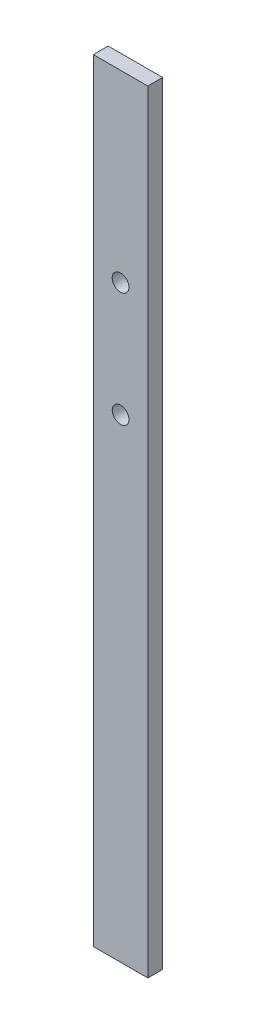
ISO-10303-21;
HEADER;
FILE_DESCRIPTION(('STEP AP214'),'2;1');
FILE_NAME('part.step','',(''),(''),'','','');
FILE_SCHEMA(('AUTOMOTIVE_DESIGN { 1 0 10303 214 1 1 1 1 }'));
ENDSEC;
DATA;
#1=APPLICATION_CONTEXT('core data for automotive mechanical design processes');
#2=APPLICATION_PROTOCOL_DEFINITION('international standard','automotive_design',2000,#1);
#3=PRODUCT_CONTEXT('',#1,'mechanical');
#4=PRODUCT('Part','Part','',(#3));
#5=PRODUCT_RELATED_PRODUCT_CATEGORY('part','',(#4));
#6=PRODUCT_DEFINITION_FORMATION('','',#4);
#7=PRODUCT_DEFINITION_CONTEXT('part definition',#1,'design');
#8=PRODUCT_DEFINITION('design','',#6,#7);
#9=PRODUCT_DEFINITION_SHAPE('','',#8);
#10=(LENGTH_UNIT() NAMED_UNIT(*) SI_UNIT(.MILLI.,.METRE.));
#11=(NAMED_UNIT(*) PLANE_ANGLE_UNIT() SI_UNIT($,.RADIAN.));
#12=(NAMED_UNIT(*) SI_UNIT($,.STERADIAN.) SOLID_ANGLE_UNIT());
#13=UNCERTAINTY_MEASURE_WITH_UNIT(LENGTH_MEASURE(1.E-05),#10,'distance_accuracy_value','');
#14=(GEOMETRIC_REPRESENTATION_CONTEXT(3) GLOBAL_UNCERTAINTY_ASSIGNED_CONTEXT((#13)) GLOBAL_UNIT_ASSIGNED_CONTEXT((#10,
#11,#12)) REPRESENTATION_CONTEXT('',''));
#15=CARTESIAN_POINT('',(0.,0.,0.));
#16=DIRECTION('',(0.,0.,1.));
#17=DIRECTION('',(1.,0.,0.));
#18=AXIS2_PLACEMENT_3D('',#15,#16,#17);
#19=CARTESIAN_POINT('',(69.85,1981.2,19.05));
#20=DIRECTION('',(-1.,0.,0.));
#21=DIRECTION('',(0.,0.,1.));
#22=AXIS2_PLACEMENT_3D('',#19,#20,#21);
#23=PLANE('',#22);
#24=DIRECTION('',(0.,0.,-1.));
#25=VECTOR('',#24,1.);
#26=CARTESIAN_POINT('',(69.85,0.,19.05));
#27=LINE('',#26,#25);
#28=CARTESIAN_POINT('',(69.85,0.,19.05));
#29=VERTEX_POINT('',#28);
#30=CARTESIAN_POINT('',(69.85,0.,-19.05));
#31=VERTEX_POINT('',#30);
#32=EDGE_CURVE('E96',#29,#31,#27,.T.);
#33=ORIENTED_EDGE('',*,*,#32,.T.);
#34=DIRECTION('',(0.,-1.,0.));
#35=VECTOR('',#34,1.);
#36=CARTESIAN_POINT('',(69.85,1981.2,-19.05));
#37=LINE('',#36,#35);
#38=CARTESIAN_POINT('',(69.85,1981.2,-19.05));
#39=VERTEX_POINT('',#38);
#40=EDGE_CURVE('E11',#39,#31,#37,.T.);
#41=ORIENTED_EDGE('',*,*,#40,.F.);
#42=DIRECTION('',(0.,0.,-1.));
#43=VECTOR('',#42,1.);
#44=CARTESIAN_POINT('',(69.85,1981.2,19.05));
#45=LINE('',#44,#43);
#46=CARTESIAN_POINT('',(69.85,1981.2,19.05));
#47=VERTEX_POINT('',#46);
#48=EDGE_CURVE('E84',#47,#39,#45,.T.);
#49=ORIENTED_EDGE('',*,*,#48,.F.);
#50=DIRECTION('',(0.,-1.,0.));
#51=VECTOR('',#50,1.);
#52=CARTESIAN_POINT('',(69.85,1981.2,19.05));
#53=LINE('',#52,#51);
#54=EDGE_CURVE('E92',#47,#29,#53,.T.);
#55=ORIENTED_EDGE('',*,*,#54,.T.);
#56=EDGE_LOOP('',(#33,#41,#49,#55));
#57=FACE_BOUND('',#56,.T.);
#58=ADVANCED_FACE('F33',(#57),#23,.F.);
#59=CARTESIAN_POINT('',(-69.85,1981.2,-19.05));
#60=DIRECTION('',(0.,0.,1.));
#61=DIRECTION('',(1.,0.,0.));
#62=AXIS2_PLACEMENT_3D('',#59,#60,#61);
#63=PLANE('',#62);
#64=CARTESIAN_POINT('',(0.,1216.025,-19.05));
#65=DIRECTION('',(0.,0.,-1.));
#66=DIRECTION('',(-1.,0.,0.));
#67=AXIS2_PLACEMENT_3D('',#64,#65,#66);
#68=CIRCLE('',#67,21.43125);
#69=CARTESIAN_POINT('',(-21.43125,1216.025,-19.05));
#70=VERTEX_POINT('',#69);
#71=EDGE_CURVE('E118',#70,#70,#68,.T.);
#72=ORIENTED_EDGE('',*,*,#71,.F.);
#73=EDGE_LOOP('',(#72));
#74=FACE_BOUND('',#73,.T.);
#75=CARTESIAN_POINT('',(0.,1509.7125,-19.05));
#76=DIRECTION('',(0.,0.,-1.));
#77=DIRECTION('',(-1.,0.,0.));
#78=AXIS2_PLACEMENT_3D('',#75,#76,#77);
#79=CIRCLE('',#78,21.43125);
#80=CARTESIAN_POINT('',(-21.43125,1509.7125,-19.05));
#81=VERTEX_POINT('',#80);
#82=EDGE_CURVE('E112',#81,#81,#79,.T.);
#83=ORIENTED_EDGE('',*,*,#82,.F.);
#84=EDGE_LOOP('',(#83));
#85=FACE_BOUND('',#84,.T.);
#86=DIRECTION('',(-1.,0.,0.));
#87=VECTOR('',#86,1.);
#88=CARTESIAN_POINT('',(-69.85,0.,-19.05));
#89=LINE('',#88,#87);
#90=CARTESIAN_POINT('',(-69.85,0.,-19.05));
#91=VERTEX_POINT('',#90);
#92=EDGE_CURVE('E88',#31,#91,#89,.T.);
#93=ORIENTED_EDGE('',*,*,#92,.T.);
#94=DIRECTION('',(0.,-1.,0.));
#95=VECTOR('',#94,1.);
#96=CARTESIAN_POINT('',(-69.85,1981.2,-19.05));
#97=LINE('',#96,#95);
#98=CARTESIAN_POINT('',(-69.85,1981.2,-19.05));
#99=VERTEX_POINT('',#98);
#100=EDGE_CURVE('E41',#99,#91,#97,.T.);
#101=ORIENTED_EDGE('',*,*,#100,.F.);
#102=DIRECTION('',(-1.,0.,0.));
#103=VECTOR('',#102,1.);
#104=CARTESIAN_POINT('',(-69.85,1981.2,-19.05));
#105=LINE('',#104,#103);
#106=EDGE_CURVE('E79',#39,#99,#105,.T.);
#107=ORIENTED_EDGE('',*,*,#106,.F.);
#108=ORIENTED_EDGE('',*,*,#40,.T.);
#109=EDGE_LOOP('',(#93,#101,#107,#108));
#110=FACE_BOUND('',#109,.T.);
#111=ADVANCED_FACE('F87',(#74,#85,#110),#63,.F.);
#112=CARTESIAN_POINT('',(-69.85,1981.2,19.05));
#113=DIRECTION('',(1.,0.,0.));
#114=DIRECTION('',(0.,0.,-1.));
#115=AXIS2_PLACEMENT_3D('',#112,#113,#114);
#116=PLANE('',#115);
#117=DIRECTION('',(0.,0.,1.));
#118=VECTOR('',#117,1.);
#119=CARTESIAN_POINT('',(-69.85,0.,19.05));
#120=LINE('',#119,#118);
#121=CARTESIAN_POINT('',(-69.85,0.,19.05));
#122=VERTEX_POINT('',#121);
#123=EDGE_CURVE('E66',#91,#122,#120,.T.);
#124=ORIENTED_EDGE('',*,*,#123,.T.);
#125=DIRECTION('',(0.,-1.,0.));
#126=VECTOR('',#125,1.);
#127=CARTESIAN_POINT('',(-69.85,1981.2,19.05));
#128=LINE('',#127,#126);
#129=CARTESIAN_POINT('',(-69.85,1981.2,19.05));
#130=VERTEX_POINT('',#129);
#131=EDGE_CURVE('E89',#130,#122,#128,.T.);
#132=ORIENTED_EDGE('',*,*,#131,.F.);
#133=DIRECTION('',(0.,0.,1.));
#134=VECTOR('',#133,1.);
#135=CARTESIAN_POINT('',(-69.85,1981.2,19.05));
#136=LINE('',#135,#134);
#137=EDGE_CURVE('E82',#99,#130,#136,.T.);
#138=ORIENTED_EDGE('',*,*,#137,.F.);
#139=ORIENTED_EDGE('',*,*,#100,.T.);
#140=EDGE_LOOP('',(#124,#132,#138,#139));
#141=FACE_BOUND('',#140,.T.);
#142=ADVANCED_FACE('F90',(#141),#116,.F.);
#143=CARTESIAN_POINT('',(-69.85,1981.2,19.05));
#144=DIRECTION('',(0.,0.,-1.));
#145=DIRECTION('',(-1.,0.,0.));
#146=AXIS2_PLACEMENT_3D('',#143,#144,#145);
#147=PLANE('',#146);
#148=CARTESIAN_POINT('',(0.,1216.025,19.05));
#149=DIRECTION('',(0.,0.,-1.));
#150=DIRECTION('',(-1.,0.,0.));
#151=AXIS2_PLACEMENT_3D('',#148,#149,#150);
#152=CIRCLE('',#151,21.43125);
#153=CARTESIAN_POINT('',(-21.43125,1216.025,19.05));
#154=VERTEX_POINT('',#153);
#155=EDGE_CURVE('E115',#154,#154,#152,.T.);
#156=ORIENTED_EDGE('',*,*,#155,.T.);
#157=EDGE_LOOP('',(#156));
#158=FACE_BOUND('',#157,.T.);
#159=CARTESIAN_POINT('',(0.,1509.7125,19.05));
#160=DIRECTION('',(0.,0.,-1.));
#161=DIRECTION('',(-1.,0.,0.));
#162=AXIS2_PLACEMENT_3D('',#159,#160,#161);
#163=CIRCLE('',#162,21.43125);
#164=CARTESIAN_POINT('',(-21.43125,1509.7125,19.05));
#165=VERTEX_POINT('',#164);
#166=EDGE_CURVE('E99',#165,#165,#163,.T.);
#167=ORIENTED_EDGE('',*,*,#166,.T.);
#168=EDGE_LOOP('',(#167));
#169=FACE_BOUND('',#168,.T.);
#170=DIRECTION('',(1.,0.,0.));
#171=VECTOR('',#170,1.);
#172=CARTESIAN_POINT('',(-69.85,0.,19.05));
#173=LINE('',#172,#171);
#174=EDGE_CURVE('E72',#122,#29,#173,.T.);
#175=ORIENTED_EDGE('',*,*,#174,.T.);
#176=ORIENTED_EDGE('',*,*,#54,.F.);
#177=DIRECTION('',(1.,0.,0.));
#178=VECTOR('',#177,1.);
#179=CARTESIAN_POINT('',(-69.85,1981.2,19.05));
#180=LINE('',#179,#178);
#181=EDGE_CURVE('E49',#130,#47,#180,.T.);
#182=ORIENTED_EDGE('',*,*,#181,.F.);
#183=ORIENTED_EDGE('',*,*,#131,.T.);
#184=EDGE_LOOP('',(#175,#176,#182,#183));
#185=FACE_BOUND('',#184,.T.);
#186=ADVANCED_FACE('F104',(#158,#169,#185),#147,.F.);
#187=CARTESIAN_POINT('',(0.,1981.2,0.));
#188=DIRECTION('',(0.,-1.,0.));
#189=DIRECTION('',(0.,0.,-1.));
#190=AXIS2_PLACEMENT_3D('',#187,#188,#189);
#191=PLANE('',#190);
#192=ORIENTED_EDGE('',*,*,#48,.T.);
#193=ORIENTED_EDGE('',*,*,#106,.T.);
#194=ORIENTED_EDGE('',*,*,#137,.T.);
#195=ORIENTED_EDGE('',*,*,#181,.T.);
#196=EDGE_LOOP('',(#192,#193,#194,#195));
#197=FACE_BOUND('',#196,.T.);
#198=ADVANCED_FACE('F80',(#197),#191,.F.);
#199=CARTESIAN_POINT('',(0.,0.,0.));
#200=DIRECTION('',(0.,-1.,0.));
#201=DIRECTION('',(0.,0.,-1.));
#202=AXIS2_PLACEMENT_3D('',#199,#200,#201);
#203=PLANE('',#202);
#204=ORIENTED_EDGE('',*,*,#32,.F.);
#205=ORIENTED_EDGE('',*,*,#174,.F.);
#206=ORIENTED_EDGE('',*,*,#123,.F.);
#207=ORIENTED_EDGE('',*,*,#92,.F.);
#208=EDGE_LOOP('',(#204,#205,#206,#207));
#209=FACE_BOUND('',#208,.T.);
#210=ADVANCED_FACE('F107',(#209),#203,.T.);
#211=CARTESIAN_POINT('',(0.,1509.7125,-19.05));
#212=DIRECTION('',(0.,0.,-1.));
#213=DIRECTION('',(-1.,0.,0.));
#214=AXIS2_PLACEMENT_3D('',#211,#212,#213);
#215=CYLINDRICAL_SURFACE('',#214,21.43125);
#216=ORIENTED_EDGE('',*,*,#166,.F.);
#217=EDGE_LOOP('',(#216));
#218=FACE_BOUND('',#217,.T.);
#219=ORIENTED_EDGE('',*,*,#82,.T.);
#220=EDGE_LOOP('',(#219));
#221=FACE_BOUND('',#220,.T.);
#222=ADVANCED_FACE('F128',(#218,#221),#215,.F.);
#223=CARTESIAN_POINT('',(0.,1216.025,-19.05));
#224=DIRECTION('',(0.,0.,-1.));
#225=DIRECTION('',(-1.,0.,0.));
#226=AXIS2_PLACEMENT_3D('',#223,#224,#225);
#227=CYLINDRICAL_SURFACE('',#226,21.43125);
#228=ORIENTED_EDGE('',*,*,#155,.F.);
#229=EDGE_LOOP('',(#228));
#230=FACE_BOUND('',#229,.T.);
#231=ORIENTED_EDGE('',*,*,#71,.T.);
#232=EDGE_LOOP('',(#231));
#233=FACE_BOUND('',#232,.T.);
#234=ADVANCED_FACE('F122',(#230,#233),#227,.F.);
#235=CLOSED_SHELL('',(#58,#111,#142,#186,#198,#210,#222,#234));
#236=MANIFOLD_SOLID_BREP('B2',#235);
#237=ADVANCED_BREP_SHAPE_REPRESENTATION('',(#18,#236),#14);
#238=SHAPE_DEFINITION_REPRESENTATION(#9,#237);
ENDSEC;
END-ISO-10303-21;
